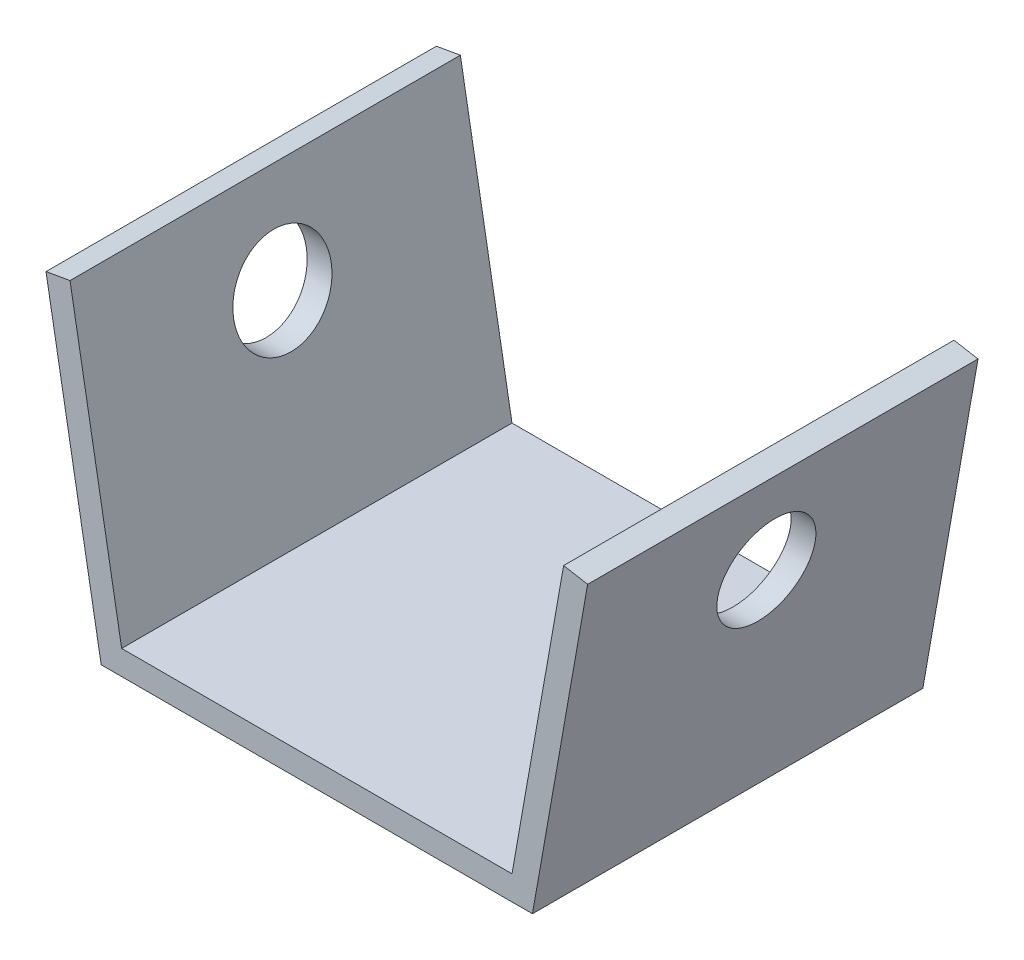
ISO-10303-21;
HEADER;
FILE_DESCRIPTION(('STEP AP214'),'2;1');
FILE_NAME('part.step','',(''),(''),'','','');
FILE_SCHEMA(('AUTOMOTIVE_DESIGN { 1 0 10303 214 1 1 1 1 }'));
ENDSEC;
DATA;
#1=APPLICATION_CONTEXT('core data for automotive mechanical design processes');
#2=APPLICATION_PROTOCOL_DEFINITION('international standard','automotive_design',2000,#1);
#3=PRODUCT_CONTEXT('',#1,'mechanical');
#4=PRODUCT('Part','Part','',(#3));
#5=PRODUCT_RELATED_PRODUCT_CATEGORY('part','',(#4));
#6=PRODUCT_DEFINITION_FORMATION('','',#4);
#7=PRODUCT_DEFINITION_CONTEXT('part definition',#1,'design');
#8=PRODUCT_DEFINITION('design','',#6,#7);
#9=PRODUCT_DEFINITION_SHAPE('','',#8);
#10=(LENGTH_UNIT() NAMED_UNIT(*) SI_UNIT(.MILLI.,.METRE.));
#11=(NAMED_UNIT(*) PLANE_ANGLE_UNIT() SI_UNIT($,.RADIAN.));
#12=(NAMED_UNIT(*) SI_UNIT($,.STERADIAN.) SOLID_ANGLE_UNIT());
#13=UNCERTAINTY_MEASURE_WITH_UNIT(LENGTH_MEASURE(1.E-05),#10,'distance_accuracy_value','');
#14=(GEOMETRIC_REPRESENTATION_CONTEXT(3) GLOBAL_UNCERTAINTY_ASSIGNED_CONTEXT((#13)) GLOBAL_UNIT_ASSIGNED_CONTEXT((#10,
#11,#12)) REPRESENTATION_CONTEXT('',''));
#15=CARTESIAN_POINT('',(0.,0.,0.));
#16=DIRECTION('',(0.,0.,1.));
#17=DIRECTION('',(1.,0.,0.));
#18=AXIS2_PLACEMENT_3D('',#15,#16,#17);
#19=CARTESIAN_POINT('',(-25.4,0.,25.4));
#20=DIRECTION('',(-0.984807753012207,-0.173648177666934,0.));
#21=DIRECTION('',(0.173648177666934,-0.984807753012208,0.));
#22=AXIS2_PLACEMENT_3D('',#19,#20,#21);
#23=PLANE('',#22);
#24=CARTESIAN_POINT('',(-29.8787053099951,25.4,0.));
#25=DIRECTION('',(-0.984807753012207,-0.173648177666934,0.));
#26=DIRECTION('',(0.173648177666934,-0.984807753012208,0.));
#27=AXIS2_PLACEMENT_3D('',#24,#25,#26);
#28=ELLIPSE('',#27,6.44795898547448,6.35);
#29=CARTESIAN_POINT('',(-28.7590289824963,19.05,0.));
#30=VERTEX_POINT('',#29);
#31=EDGE_CURVE('E135',#30,#30,#28,.T.);
#32=ORIENTED_EDGE('',*,*,#31,.T.);
#33=EDGE_LOOP('',(#32));
#34=FACE_BOUND('',#33,.T.);
#35=DIRECTION('',(-0.173648177666934,0.984807753012207,0.));
#36=VECTOR('',#35,1.);
#37=CARTESIAN_POINT('',(-25.4,0.,-25.4));
#38=LINE('',#37,#36);
#39=CARTESIAN_POINT('',(-25.4,0.,-25.4));
#40=VERTEX_POINT('',#39);
#41=CARTESIAN_POINT('',(-32.1180579649927,38.1,-25.4));
#42=VERTEX_POINT('',#41);
#43=EDGE_CURVE('E131',#40,#42,#38,.T.);
#44=ORIENTED_EDGE('',*,*,#43,.T.);
#45=DIRECTION('',(0.,0.,-1.));
#46=VECTOR('',#45,1.);
#47=CARTESIAN_POINT('',(-32.1180579649927,38.1,25.4));
#48=LINE('',#47,#46);
#49=CARTESIAN_POINT('',(-32.1180579649927,38.1,25.4));
#50=VERTEX_POINT('',#49);
#51=EDGE_CURVE('E11',#50,#42,#48,.T.);
#52=ORIENTED_EDGE('',*,*,#51,.F.);
#53=DIRECTION('',(-0.173648177666934,0.984807753012207,0.));
#54=VECTOR('',#53,1.);
#55=CARTESIAN_POINT('',(-25.4,0.,25.4));
#56=LINE('',#55,#54);
#57=CARTESIAN_POINT('',(-25.4,0.,25.4));
#58=VERTEX_POINT('',#57);
#59=EDGE_CURVE('E146',#58,#50,#56,.T.);
#60=ORIENTED_EDGE('',*,*,#59,.F.);
#61=DIRECTION('',(0.,0.,-1.));
#62=VECTOR('',#61,1.);
#63=CARTESIAN_POINT('',(-25.4,0.,25.4));
#64=LINE('',#63,#62);
#65=EDGE_CURVE('E127',#58,#40,#64,.T.);
#66=ORIENTED_EDGE('',*,*,#65,.T.);
#67=EDGE_LOOP('',(#44,#52,#60,#66));
#68=FACE_BOUND('',#67,.T.);
#69=ADVANCED_FACE('F34',(#34,#68),#23,.F.);
#70=CARTESIAN_POINT('',(-35.2448225808064,37.5486670359075,25.4));
#71=DIRECTION('',(0.173648177666932,-0.984807753012208,0.));
#72=DIRECTION('',(0.984807753012208,0.173648177666932,0.));
#73=AXIS2_PLACEMENT_3D('',#70,#71,#72);
#74=PLANE('',#73);
#75=DIRECTION('',(-0.984807753012208,-0.173648177666932,0.));
#76=VECTOR('',#75,1.);
#77=CARTESIAN_POINT('',(-35.2448225808064,37.5486670359075,-25.4));
#78=LINE('',#77,#76);
#79=CARTESIAN_POINT('',(-35.2448225808064,37.5486670359075,-25.4));
#80=VERTEX_POINT('',#79);
#81=EDGE_CURVE('E134',#42,#80,#78,.T.);
#82=ORIENTED_EDGE('',*,*,#81,.T.);
#83=DIRECTION('',(0.,0.,-1.));
#84=VECTOR('',#83,1.);
#85=CARTESIAN_POINT('',(-35.2448225808064,37.5486670359075,25.4));
#86=LINE('',#85,#84);
#87=CARTESIAN_POINT('',(-35.2448225808064,37.5486670359075,25.4));
#88=VERTEX_POINT('',#87);
#89=EDGE_CURVE('E43',#88,#80,#86,.T.);
#90=ORIENTED_EDGE('',*,*,#89,.F.);
#91=DIRECTION('',(-0.984807753012208,-0.173648177666932,0.));
#92=VECTOR('',#91,1.);
#93=CARTESIAN_POINT('',(-35.2448225808064,37.5486670359075,25.4));
#94=LINE('',#93,#92);
#95=EDGE_CURVE('E94',#50,#88,#94,.T.);
#96=ORIENTED_EDGE('',*,*,#95,.F.);
#97=ORIENTED_EDGE('',*,*,#51,.T.);
#98=EDGE_LOOP('',(#82,#90,#96,#97));
#99=FACE_BOUND('',#98,.T.);
#100=ADVANCED_FACE('F206',(#99),#74,.F.);
#101=CARTESIAN_POINT('',(-28.0641413289879,-3.175,25.4));
#102=DIRECTION('',(0.984807753012207,0.173648177666934,0.));
#103=DIRECTION('',(-0.173648177666934,0.984807753012207,0.));
#104=AXIS2_PLACEMENT_3D('',#101,#102,#103);
#105=PLANE('',#104);
#106=CARTESIAN_POINT('',(-33.1026848027323,25.4,0.));
#107=DIRECTION('',(0.984807753012207,0.173648177666934,0.));
#108=DIRECTION('',(0.173648177666934,-0.984807753012207,0.));
#109=AXIS2_PLACEMENT_3D('',#106,#107,#108);
#110=ELLIPSE('',#109,6.44795898547448,6.35);
#111=CARTESIAN_POINT('',(-31.9830084752336,19.05,0.));
#112=VERTEX_POINT('',#111);
#113=EDGE_CURVE('E182',#112,#112,#110,.T.);
#114=ORIENTED_EDGE('',*,*,#113,.T.);
#115=EDGE_LOOP('',(#114));
#116=FACE_BOUND('',#115,.T.);
#117=DIRECTION('',(0.173648177666934,-0.984807753012207,0.));
#118=VECTOR('',#117,1.);
#119=CARTESIAN_POINT('',(-28.0641413289879,-3.175,-25.4));
#120=LINE('',#119,#118);
#121=CARTESIAN_POINT('',(-28.0641413289879,-3.175,-25.4));
#122=VERTEX_POINT('',#121);
#123=EDGE_CURVE('E137',#80,#122,#120,.T.);
#124=ORIENTED_EDGE('',*,*,#123,.T.);
#125=DIRECTION('',(0.,0.,-1.));
#126=VECTOR('',#125,1.);
#127=CARTESIAN_POINT('',(-28.0641413289879,-3.175,25.4));
#128=LINE('',#127,#126);
#129=CARTESIAN_POINT('',(-28.0641413289879,-3.175,25.4));
#130=VERTEX_POINT('',#129);
#131=EDGE_CURVE('E153',#130,#122,#128,.T.);
#132=ORIENTED_EDGE('',*,*,#131,.F.);
#133=DIRECTION('',(0.173648177666934,-0.984807753012207,0.));
#134=VECTOR('',#133,1.);
#135=CARTESIAN_POINT('',(-28.0641413289879,-3.175,25.4));
#136=LINE('',#135,#134);
#137=EDGE_CURVE('E162',#88,#130,#136,.T.);
#138=ORIENTED_EDGE('',*,*,#137,.F.);
#139=ORIENTED_EDGE('',*,*,#89,.T.);
#140=EDGE_LOOP('',(#124,#132,#138,#139));
#141=FACE_BOUND('',#140,.T.);
#142=ADVANCED_FACE('F160',(#116,#141),#105,.F.);
#143=CARTESIAN_POINT('',(-28.0641413289879,-3.175,25.4));
#144=DIRECTION('',(0.,1.,0.));
#145=DIRECTION('',(0.,0.,1.));
#146=AXIS2_PLACEMENT_3D('',#143,#144,#145);
#147=PLANE('',#146);
#148=DIRECTION('',(1.,0.,0.));
#149=VECTOR('',#148,1.);
#150=CARTESIAN_POINT('',(-28.0641413289879,-3.175,-25.4));
#151=LINE('',#150,#149);
#152=CARTESIAN_POINT('',(28.0641413289879,-3.175,-25.4));
#153=VERTEX_POINT('',#152);
#154=EDGE_CURVE('E139',#122,#153,#151,.T.);
#155=ORIENTED_EDGE('',*,*,#154,.T.);
#156=DIRECTION('',(0.,0.,-1.));
#157=VECTOR('',#156,1.);
#158=CARTESIAN_POINT('',(28.0641413289879,-3.175,25.4));
#159=LINE('',#158,#157);
#160=CARTESIAN_POINT('',(28.0641413289879,-3.175,25.4));
#161=VERTEX_POINT('',#160);
#162=EDGE_CURVE('E150',#161,#153,#159,.T.);
#163=ORIENTED_EDGE('',*,*,#162,.F.);
#164=DIRECTION('',(1.,0.,0.));
#165=VECTOR('',#164,1.);
#166=CARTESIAN_POINT('',(-28.0641413289879,-3.175,25.4));
#167=LINE('',#166,#165);
#168=EDGE_CURVE('E174',#130,#161,#167,.T.);
#169=ORIENTED_EDGE('',*,*,#168,.F.);
#170=ORIENTED_EDGE('',*,*,#131,.T.);
#171=EDGE_LOOP('',(#155,#163,#169,#170));
#172=FACE_BOUND('',#171,.T.);
#173=ADVANCED_FACE('F170',(#172),#147,.F.);
#174=CARTESIAN_POINT('',(28.0641413289879,-3.175,25.4));
#175=DIRECTION('',(-0.984807753012209,0.173648177666927,0.));
#176=DIRECTION('',(-0.173648177666927,-0.984807753012209,0.));
#177=AXIS2_PLACEMENT_3D('',#174,#175,#176);
#178=PLANE('',#177);
#179=CARTESIAN_POINT('',(33.1026848027321,25.4,0.));
#180=DIRECTION('',(-0.984807753012209,0.173648177666927,0.));
#181=DIRECTION('',(0.173648177666927,0.984807753012209,0.));
#182=AXIS2_PLACEMENT_3D('',#179,#180,#181);
#183=ELLIPSE('',#182,6.44795898547448,6.35);
#184=CARTESIAN_POINT('',(34.2223611302309,31.75,0.));
#185=VERTEX_POINT('',#184);
#186=EDGE_CURVE('E185',#185,#185,#183,.T.);
#187=ORIENTED_EDGE('',*,*,#186,.T.);
#188=EDGE_LOOP('',(#187));
#189=FACE_BOUND('',#188,.T.);
#190=DIRECTION('',(0.173648177666927,0.984807753012209,0.));
#191=VECTOR('',#190,1.);
#192=CARTESIAN_POINT('',(28.0641413289879,-3.175,-25.4));
#193=LINE('',#192,#191);
#194=CARTESIAN_POINT('',(35.2448225808061,37.5486670359075,-25.4));
#195=VERTEX_POINT('',#194);
#196=EDGE_CURVE('E141',#153,#195,#193,.T.);
#197=ORIENTED_EDGE('',*,*,#196,.T.);
#198=DIRECTION('',(0.,0.,-1.));
#199=VECTOR('',#198,1.);
#200=CARTESIAN_POINT('',(35.2448225808061,37.5486670359075,25.4));
#201=LINE('',#200,#199);
#202=CARTESIAN_POINT('',(35.2448225808061,37.5486670359075,25.4));
#203=VERTEX_POINT('',#202);
#204=EDGE_CURVE('E122',#203,#195,#201,.T.);
#205=ORIENTED_EDGE('',*,*,#204,.F.);
#206=DIRECTION('',(0.173648177666927,0.984807753012209,0.));
#207=VECTOR('',#206,1.);
#208=CARTESIAN_POINT('',(28.0641413289879,-3.175,25.4));
#209=LINE('',#208,#207);
#210=EDGE_CURVE('E113',#161,#203,#209,.T.);
#211=ORIENTED_EDGE('',*,*,#210,.F.);
#212=ORIENTED_EDGE('',*,*,#162,.T.);
#213=EDGE_LOOP('',(#197,#205,#211,#212));
#214=FACE_BOUND('',#213,.T.);
#215=ADVANCED_FACE('F173',(#189,#214),#178,.F.);
#216=CARTESIAN_POINT('',(32.1180579649924,38.1,25.4));
#217=DIRECTION('',(-0.173648177666927,-0.984807753012209,0.));
#218=DIRECTION('',(0.984807753012209,-0.173648177666927,0.));
#219=AXIS2_PLACEMENT_3D('',#216,#217,#218);
#220=PLANE('',#219);
#221=DIRECTION('',(-0.984807753012209,0.173648177666927,0.));
#222=VECTOR('',#221,1.);
#223=CARTESIAN_POINT('',(32.1180579649924,38.1,-25.4));
#224=LINE('',#223,#222);
#225=CARTESIAN_POINT('',(32.1180579649924,38.1,-25.4));
#226=VERTEX_POINT('',#225);
#227=EDGE_CURVE('E121',#195,#226,#224,.T.);
#228=ORIENTED_EDGE('',*,*,#227,.T.);
#229=DIRECTION('',(0.,0.,-1.));
#230=VECTOR('',#229,1.);
#231=CARTESIAN_POINT('',(32.1180579649924,38.1,25.4));
#232=LINE('',#231,#230);
#233=CARTESIAN_POINT('',(32.1180579649924,38.1,25.4));
#234=VERTEX_POINT('',#233);
#235=EDGE_CURVE('E118',#234,#226,#232,.T.);
#236=ORIENTED_EDGE('',*,*,#235,.F.);
#237=DIRECTION('',(-0.984807753012209,0.173648177666927,0.));
#238=VECTOR('',#237,1.);
#239=CARTESIAN_POINT('',(32.1180579649924,38.1,25.4));
#240=LINE('',#239,#238);
#241=EDGE_CURVE('E107',#203,#234,#240,.T.);
#242=ORIENTED_EDGE('',*,*,#241,.F.);
#243=ORIENTED_EDGE('',*,*,#204,.T.);
#244=EDGE_LOOP('',(#228,#236,#242,#243));
#245=FACE_BOUND('',#244,.T.);
#246=ADVANCED_FACE('F119',(#245),#220,.F.);
#247=CARTESIAN_POINT('',(25.4,0.,25.4));
#248=DIRECTION('',(0.984807753012209,-0.173648177666927,0.));
#249=DIRECTION('',(0.173648177666927,0.984807753012209,0.));
#250=AXIS2_PLACEMENT_3D('',#247,#248,#249);
#251=PLANE('',#250);
#252=CARTESIAN_POINT('',(29.8787053099949,25.4,0.));
#253=DIRECTION('',(0.984807753012209,-0.173648177666927,0.));
#254=DIRECTION('',(0.173648177666927,0.984807753012209,0.));
#255=AXIS2_PLACEMENT_3D('',#252,#253,#254);
#256=ELLIPSE('',#255,6.44795898547448,6.35);
#257=CARTESIAN_POINT('',(30.9983816374936,31.75,0.));
#258=VERTEX_POINT('',#257);
#259=EDGE_CURVE('E37',#258,#258,#256,.T.);
#260=ORIENTED_EDGE('',*,*,#259,.T.);
#261=EDGE_LOOP('',(#260));
#262=FACE_BOUND('',#261,.T.);
#263=DIRECTION('',(-0.173648177666927,-0.984807753012209,0.));
#264=VECTOR('',#263,1.);
#265=CARTESIAN_POINT('',(25.4,0.,-25.4));
#266=LINE('',#265,#264);
#267=CARTESIAN_POINT('',(25.4,0.,-25.4));
#268=VERTEX_POINT('',#267);
#269=EDGE_CURVE('E80',#226,#268,#266,.T.);
#270=ORIENTED_EDGE('',*,*,#269,.T.);
#271=DIRECTION('',(0.,0.,-1.));
#272=VECTOR('',#271,1.);
#273=CARTESIAN_POINT('',(25.4,0.,25.4));
#274=LINE('',#273,#272);
#275=CARTESIAN_POINT('',(25.4,0.,25.4));
#276=VERTEX_POINT('',#275);
#277=EDGE_CURVE('E123',#276,#268,#274,.T.);
#278=ORIENTED_EDGE('',*,*,#277,.F.);
#279=DIRECTION('',(-0.173648177666927,-0.984807753012209,0.));
#280=VECTOR('',#279,1.);
#281=CARTESIAN_POINT('',(25.4,0.,25.4));
#282=LINE('',#281,#280);
#283=EDGE_CURVE('E111',#234,#276,#282,.T.);
#284=ORIENTED_EDGE('',*,*,#283,.F.);
#285=ORIENTED_EDGE('',*,*,#235,.T.);
#286=EDGE_LOOP('',(#270,#278,#284,#285));
#287=FACE_BOUND('',#286,.T.);
#288=ADVANCED_FACE('F125',(#262,#287),#251,.F.);
#289=CARTESIAN_POINT('',(-25.4,0.,25.4));
#290=DIRECTION('',(0.,-1.,0.));
#291=DIRECTION('',(0.,0.,-1.));
#292=AXIS2_PLACEMENT_3D('',#289,#290,#291);
#293=PLANE('',#292);
#294=DIRECTION('',(-1.,0.,0.));
#295=VECTOR('',#294,1.);
#296=CARTESIAN_POINT('',(-25.4,0.,-25.4));
#297=LINE('',#296,#295);
#298=EDGE_CURVE('E86',#268,#40,#297,.T.);
#299=ORIENTED_EDGE('',*,*,#298,.T.);
#300=ORIENTED_EDGE('',*,*,#65,.F.);
#301=DIRECTION('',(-1.,0.,0.));
#302=VECTOR('',#301,1.);
#303=CARTESIAN_POINT('',(-25.4,0.,25.4));
#304=LINE('',#303,#302);
#305=EDGE_CURVE('E51',#276,#58,#304,.T.);
#306=ORIENTED_EDGE('',*,*,#305,.F.);
#307=ORIENTED_EDGE('',*,*,#277,.T.);
#308=EDGE_LOOP('',(#299,#300,#306,#307));
#309=FACE_BOUND('',#308,.T.);
#310=ADVANCED_FACE('F215',(#309),#293,.F.);
#311=CARTESIAN_POINT('',(-32.1180579649927,38.1,25.4));
#312=DIRECTION('',(0.,0.,-1.));
#313=DIRECTION('',(-1.,0.,0.));
#314=AXIS2_PLACEMENT_3D('',#311,#312,#313);
#315=PLANE('',#314);
#316=ORIENTED_EDGE('',*,*,#59,.T.);
#317=ORIENTED_EDGE('',*,*,#95,.T.);
#318=ORIENTED_EDGE('',*,*,#137,.T.);
#319=ORIENTED_EDGE('',*,*,#168,.T.);
#320=ORIENTED_EDGE('',*,*,#210,.T.);
#321=ORIENTED_EDGE('',*,*,#241,.T.);
#322=ORIENTED_EDGE('',*,*,#283,.T.);
#323=ORIENTED_EDGE('',*,*,#305,.T.);
#324=EDGE_LOOP('',(#316,#317,#318,#319,#320,#321,#322,#323));
#325=FACE_BOUND('',#324,.T.);
#326=ADVANCED_FACE('F109',(#325),#315,.F.);
#327=CARTESIAN_POINT('',(-32.1180579649927,38.1,-25.4));
#328=DIRECTION('',(0.,0.,-1.));
#329=DIRECTION('',(-1.,0.,0.));
#330=AXIS2_PLACEMENT_3D('',#327,#328,#329);
#331=PLANE('',#330);
#332=ORIENTED_EDGE('',*,*,#43,.F.);
#333=ORIENTED_EDGE('',*,*,#298,.F.);
#334=ORIENTED_EDGE('',*,*,#269,.F.);
#335=ORIENTED_EDGE('',*,*,#227,.F.);
#336=ORIENTED_EDGE('',*,*,#196,.F.);
#337=ORIENTED_EDGE('',*,*,#154,.F.);
#338=ORIENTED_EDGE('',*,*,#123,.F.);
#339=ORIENTED_EDGE('',*,*,#81,.F.);
#340=EDGE_LOOP('',(#332,#333,#334,#335,#336,#337,#338,#339));
#341=FACE_BOUND('',#340,.T.);
#342=ADVANCED_FACE('F166',(#341),#331,.T.);
#343=CARTESIAN_POINT('',(-35.2448225808064,25.4,0.));
#344=DIRECTION('',(1.,0.,0.));
#345=DIRECTION('',(0.,0.,-1.));
#346=AXIS2_PLACEMENT_3D('',#343,#344,#345);
#347=CYLINDRICAL_SURFACE('',#346,6.35);
#348=ORIENTED_EDGE('',*,*,#259,.F.);
#349=EDGE_LOOP('',(#348));
#350=FACE_BOUND('',#349,.T.);
#351=ORIENTED_EDGE('',*,*,#186,.F.);
#352=EDGE_LOOP('',(#351));
#353=FACE_BOUND('',#352,.T.);
#354=ADVANCED_FACE('F193',(#350,#353),#347,.F.);
#355=ORIENTED_EDGE('',*,*,#113,.F.);
#356=EDGE_LOOP('',(#355));
#357=FACE_BOUND('',#356,.T.);
#358=ORIENTED_EDGE('',*,*,#31,.F.);
#359=EDGE_LOOP('',(#358));
#360=FACE_BOUND('',#359,.T.);
#361=ADVANCED_FACE('F196',(#357,#360),#347,.F.);
#362=CLOSED_SHELL('',(#69,#100,#142,#173,#215,#246,#288,#310,#326,#342,#354,#361));
#363=MANIFOLD_SOLID_BREP('B2',#362);
#364=ADVANCED_BREP_SHAPE_REPRESENTATION('',(#18,#363),#14);
#365=SHAPE_DEFINITION_REPRESENTATION(#9,#364);
ENDSEC;
END-ISO-10303-21;
